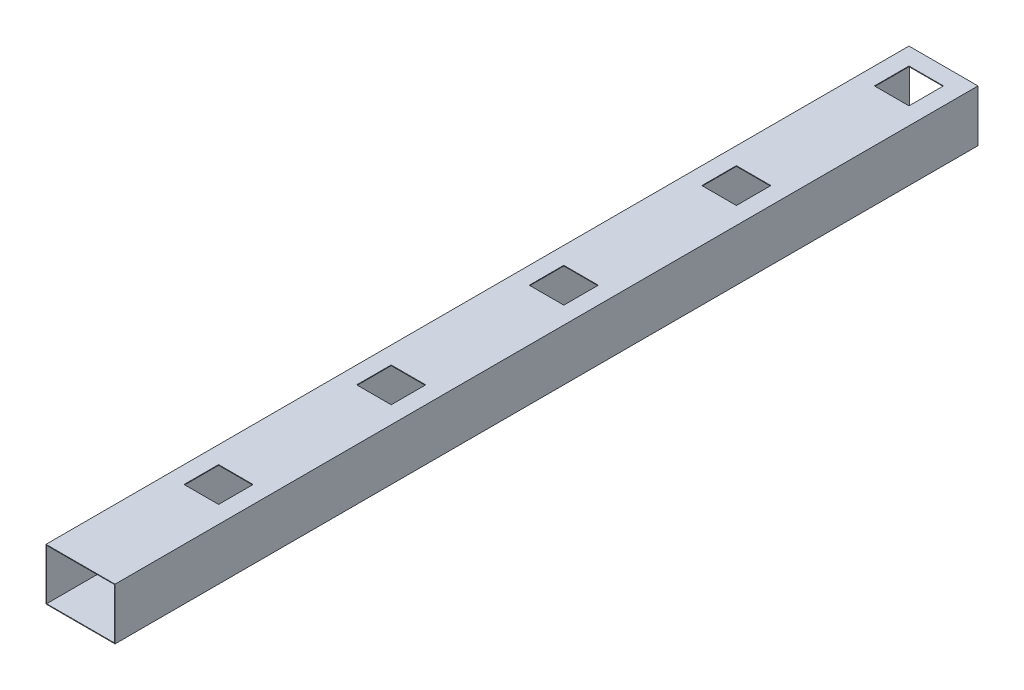
ISO-10303-21;
HEADER;
FILE_DESCRIPTION(('STEP AP214'),'2;1');
FILE_NAME('part.step','',(''),(''),'','','');
FILE_SCHEMA(('AUTOMOTIVE_DESIGN { 1 0 10303 214 1 1 1 1 }'));
ENDSEC;
DATA;
#1=APPLICATION_CONTEXT('core data for automotive mechanical design processes');
#2=APPLICATION_PROTOCOL_DEFINITION('international standard','automotive_design',2000,#1);
#3=PRODUCT_CONTEXT('',#1,'mechanical');
#4=PRODUCT('Part','Part','',(#3));
#5=PRODUCT_RELATED_PRODUCT_CATEGORY('part','',(#4));
#6=PRODUCT_DEFINITION_FORMATION('','',#4);
#7=PRODUCT_DEFINITION_CONTEXT('part definition',#1,'design');
#8=PRODUCT_DEFINITION('design','',#6,#7);
#9=PRODUCT_DEFINITION_SHAPE('','',#8);
#10=(LENGTH_UNIT() NAMED_UNIT(*) SI_UNIT(.MILLI.,.METRE.));
#11=(NAMED_UNIT(*) PLANE_ANGLE_UNIT() SI_UNIT($,.RADIAN.));
#12=(NAMED_UNIT(*) SI_UNIT($,.STERADIAN.) SOLID_ANGLE_UNIT());
#13=UNCERTAINTY_MEASURE_WITH_UNIT(LENGTH_MEASURE(1.E-05),#10,'distance_accuracy_value','');
#14=(GEOMETRIC_REPRESENTATION_CONTEXT(3) GLOBAL_UNCERTAINTY_ASSIGNED_CONTEXT((#13)) GLOBAL_UNIT_ASSIGNED_CONTEXT((#10,
#11,#12)) REPRESENTATION_CONTEXT('',''));
#15=CARTESIAN_POINT('',(0.,0.,0.));
#16=DIRECTION('',(0.,0.,1.));
#17=DIRECTION('',(1.,0.,0.));
#18=AXIS2_PLACEMENT_3D('',#15,#16,#17);
#19=CARTESIAN_POINT('',(-20.,-30.001,860.));
#20=DIRECTION('',(0.,0.,1.));
#21=DIRECTION('',(1.,0.,0.));
#22=AXIS2_PLACEMENT_3D('',#19,#20,#21);
#23=PLANE('',#22);
#24=DIRECTION('',(0.,1.,0.));
#25=VECTOR('',#24,1.);
#26=CARTESIAN_POINT('',(-20.,-30.001,860.));
#27=LINE('',#26,#25);
#28=CARTESIAN_POINT('',(-20.,29.3,860.));
#29=VERTEX_POINT('',#28);
#30=CARTESIAN_POINT('',(-20.,30.,860.));
#31=VERTEX_POINT('',#30);
#32=EDGE_CURVE('E11',#29,#31,#27,.T.);
#33=ORIENTED_EDGE('',*,*,#32,.T.);
#34=DIRECTION('',(1.,0.,0.));
#35=VECTOR('',#34,1.);
#36=CARTESIAN_POINT('',(-20.,30.,860.));
#37=LINE('',#36,#35);
#38=CARTESIAN_POINT('',(20.,30.,860.));
#39=VERTEX_POINT('',#38);
#40=EDGE_CURVE('E419',#31,#39,#37,.T.);
#41=ORIENTED_EDGE('',*,*,#40,.T.);
#42=DIRECTION('',(0.,1.,0.));
#43=VECTOR('',#42,1.);
#44=CARTESIAN_POINT('',(20.,-30.001,860.));
#45=LINE('',#44,#43);
#46=CARTESIAN_POINT('',(20.,29.3,860.));
#47=VERTEX_POINT('',#46);
#48=EDGE_CURVE('E425',#47,#39,#45,.T.);
#49=ORIENTED_EDGE('',*,*,#48,.F.);
#50=DIRECTION('',(1.,0.,0.));
#51=VECTOR('',#50,1.);
#52=CARTESIAN_POINT('',(-20.,29.3,860.));
#53=LINE('',#52,#51);
#54=EDGE_CURVE('E415',#29,#47,#53,.T.);
#55=ORIENTED_EDGE('',*,*,#54,.F.);
#56=EDGE_LOOP('',(#33,#41,#49,#55));
#57=FACE_BOUND('',#56,.T.);
#58=ADVANCED_FACE('F34',(#57),#23,.F.);
#59=CARTESIAN_POINT('',(-20.,-30.001,820.));
#60=DIRECTION('',(-1.,0.,0.));
#61=DIRECTION('',(0.,0.,1.));
#62=AXIS2_PLACEMENT_3D('',#59,#60,#61);
#63=PLANE('',#62);
#64=DIRECTION('',(0.,1.,0.));
#65=VECTOR('',#64,1.);
#66=CARTESIAN_POINT('',(-20.,-30.001,820.));
#67=LINE('',#66,#65);
#68=CARTESIAN_POINT('',(-20.,29.3,820.));
#69=VERTEX_POINT('',#68);
#70=CARTESIAN_POINT('',(-20.,30.,820.));
#71=VERTEX_POINT('',#70);
#72=EDGE_CURVE('E41',#69,#71,#67,.T.);
#73=ORIENTED_EDGE('',*,*,#72,.T.);
#74=DIRECTION('',(0.,0.,1.));
#75=VECTOR('',#74,1.);
#76=CARTESIAN_POINT('',(-20.,30.,820.));
#77=LINE('',#76,#75);
#78=EDGE_CURVE('E55',#71,#31,#77,.T.);
#79=ORIENTED_EDGE('',*,*,#78,.T.);
#80=ORIENTED_EDGE('',*,*,#32,.F.);
#81=DIRECTION('',(0.,0.,1.));
#82=VECTOR('',#81,1.);
#83=CARTESIAN_POINT('',(-20.,29.3,820.));
#84=LINE('',#83,#82);
#85=EDGE_CURVE('E413',#69,#29,#84,.T.);
#86=ORIENTED_EDGE('',*,*,#85,.F.);
#87=EDGE_LOOP('',(#73,#79,#80,#86));
#88=FACE_BOUND('',#87,.T.);
#89=ADVANCED_FACE('F433',(#88),#63,.F.);
#90=CARTESIAN_POINT('',(-20.,-30.001,820.));
#91=DIRECTION('',(0.,0.,1.));
#92=DIRECTION('',(1.,0.,0.));
#93=AXIS2_PLACEMENT_3D('',#90,#91,#92);
#94=PLANE('',#93);
#95=DIRECTION('',(1.,0.,0.));
#96=VECTOR('',#95,1.);
#97=CARTESIAN_POINT('',(-20.,29.3,820.));
#98=LINE('',#97,#96);
#99=CARTESIAN_POINT('',(20.,29.3,820.));
#100=VERTEX_POINT('',#99);
#101=EDGE_CURVE('E410',#69,#100,#98,.T.);
#102=ORIENTED_EDGE('',*,*,#101,.T.);
#103=DIRECTION('',(0.,1.,0.));
#104=VECTOR('',#103,1.);
#105=CARTESIAN_POINT('',(20.,-30.001,820.));
#106=LINE('',#105,#104);
#107=CARTESIAN_POINT('',(20.,30.,820.));
#108=VERTEX_POINT('',#107);
#109=EDGE_CURVE('E427',#100,#108,#106,.T.);
#110=ORIENTED_EDGE('',*,*,#109,.T.);
#111=DIRECTION('',(1.,0.,0.));
#112=VECTOR('',#111,1.);
#113=CARTESIAN_POINT('',(-20.,30.,820.));
#114=LINE('',#113,#112);
#115=EDGE_CURVE('E423',#71,#108,#114,.T.);
#116=ORIENTED_EDGE('',*,*,#115,.F.);
#117=ORIENTED_EDGE('',*,*,#72,.F.);
#118=EDGE_LOOP('',(#102,#110,#116,#117));
#119=FACE_BOUND('',#118,.T.);
#120=ADVANCED_FACE('F436',(#119),#94,.T.);
#121=CARTESIAN_POINT('',(20.,-30.001,820.));
#122=DIRECTION('',(-1.,0.,0.));
#123=DIRECTION('',(0.,0.,1.));
#124=AXIS2_PLACEMENT_3D('',#121,#122,#123);
#125=PLANE('',#124);
#126=DIRECTION('',(0.,0.,1.));
#127=VECTOR('',#126,1.);
#128=CARTESIAN_POINT('',(20.,29.3,820.));
#129=LINE('',#128,#127);
#130=EDGE_CURVE('E408',#100,#47,#129,.T.);
#131=ORIENTED_EDGE('',*,*,#130,.T.);
#132=ORIENTED_EDGE('',*,*,#48,.T.);
#133=DIRECTION('',(0.,0.,1.));
#134=VECTOR('',#133,1.);
#135=CARTESIAN_POINT('',(20.,30.,820.));
#136=LINE('',#135,#134);
#137=EDGE_CURVE('E48',#108,#39,#136,.T.);
#138=ORIENTED_EDGE('',*,*,#137,.F.);
#139=ORIENTED_EDGE('',*,*,#109,.F.);
#140=EDGE_LOOP('',(#131,#132,#138,#139));
#141=FACE_BOUND('',#140,.T.);
#142=ADVANCED_FACE('F440',(#141),#125,.T.);
#143=CARTESIAN_POINT('',(-20.,-30.001,660.));
#144=DIRECTION('',(0.,0.,1.));
#145=DIRECTION('',(1.,0.,0.));
#146=AXIS2_PLACEMENT_3D('',#143,#144,#145);
#147=PLANE('',#146);
#148=DIRECTION('',(0.,1.,0.));
#149=VECTOR('',#148,1.);
#150=CARTESIAN_POINT('',(-20.,-30.001,660.));
#151=LINE('',#150,#149);
#152=CARTESIAN_POINT('',(-20.,29.3,660.));
#153=VERTEX_POINT('',#152);
#154=CARTESIAN_POINT('',(-20.,30.,660.));
#155=VERTEX_POINT('',#154);
#156=EDGE_CURVE('E405',#153,#155,#151,.T.);
#157=ORIENTED_EDGE('',*,*,#156,.T.);
#158=DIRECTION('',(1.,0.,0.));
#159=VECTOR('',#158,1.);
#160=CARTESIAN_POINT('',(-20.,30.,660.));
#161=LINE('',#160,#159);
#162=CARTESIAN_POINT('',(20.,30.,660.));
#163=VERTEX_POINT('',#162);
#164=EDGE_CURVE('E387',#155,#163,#161,.T.);
#165=ORIENTED_EDGE('',*,*,#164,.T.);
#166=DIRECTION('',(0.,1.,0.));
#167=VECTOR('',#166,1.);
#168=CARTESIAN_POINT('',(20.,-30.001,660.));
#169=LINE('',#168,#167);
#170=CARTESIAN_POINT('',(20.,29.3,660.));
#171=VERTEX_POINT('',#170);
#172=EDGE_CURVE('E396',#171,#163,#169,.T.);
#173=ORIENTED_EDGE('',*,*,#172,.F.);
#174=DIRECTION('',(1.,0.,0.));
#175=VECTOR('',#174,1.);
#176=CARTESIAN_POINT('',(-20.,29.3,660.));
#177=LINE('',#176,#175);
#178=EDGE_CURVE('E382',#153,#171,#177,.T.);
#179=ORIENTED_EDGE('',*,*,#178,.F.);
#180=EDGE_LOOP('',(#157,#165,#173,#179));
#181=FACE_BOUND('',#180,.T.);
#182=ADVANCED_FACE('F472',(#181),#147,.F.);
#183=CARTESIAN_POINT('',(-20.,-30.001,620.));
#184=DIRECTION('',(-1.,0.,0.));
#185=DIRECTION('',(0.,0.,1.));
#186=AXIS2_PLACEMENT_3D('',#183,#184,#185);
#187=PLANE('',#186);
#188=DIRECTION('',(0.,1.,0.));
#189=VECTOR('',#188,1.);
#190=CARTESIAN_POINT('',(-20.,-30.001,620.));
#191=LINE('',#190,#189);
#192=CARTESIAN_POINT('',(-20.,29.3,620.));
#193=VERTEX_POINT('',#192);
#194=CARTESIAN_POINT('',(-20.,30.,620.));
#195=VERTEX_POINT('',#194);
#196=EDGE_CURVE('E402',#193,#195,#191,.T.);
#197=ORIENTED_EDGE('',*,*,#196,.T.);
#198=DIRECTION('',(0.,0.,1.));
#199=VECTOR('',#198,1.);
#200=CARTESIAN_POINT('',(-20.,30.,620.));
#201=LINE('',#200,#199);
#202=EDGE_CURVE('E390',#195,#155,#201,.T.);
#203=ORIENTED_EDGE('',*,*,#202,.T.);
#204=ORIENTED_EDGE('',*,*,#156,.F.);
#205=DIRECTION('',(0.,0.,1.));
#206=VECTOR('',#205,1.);
#207=CARTESIAN_POINT('',(-20.,29.3,620.));
#208=LINE('',#207,#206);
#209=EDGE_CURVE('E380',#193,#153,#208,.T.);
#210=ORIENTED_EDGE('',*,*,#209,.F.);
#211=EDGE_LOOP('',(#197,#203,#204,#210));
#212=FACE_BOUND('',#211,.T.);
#213=ADVANCED_FACE('F475',(#212),#187,.F.);
#214=CARTESIAN_POINT('',(-20.,-30.001,620.));
#215=DIRECTION('',(0.,0.,1.));
#216=DIRECTION('',(1.,0.,0.));
#217=AXIS2_PLACEMENT_3D('',#214,#215,#216);
#218=PLANE('',#217);
#219=DIRECTION('',(1.,0.,0.));
#220=VECTOR('',#219,1.);
#221=CARTESIAN_POINT('',(-20.,29.3,620.));
#222=LINE('',#221,#220);
#223=CARTESIAN_POINT('',(20.,29.3,620.));
#224=VERTEX_POINT('',#223);
#225=EDGE_CURVE('E377',#193,#224,#222,.T.);
#226=ORIENTED_EDGE('',*,*,#225,.T.);
#227=DIRECTION('',(0.,1.,0.));
#228=VECTOR('',#227,1.);
#229=CARTESIAN_POINT('',(20.,-30.001,620.));
#230=LINE('',#229,#228);
#231=CARTESIAN_POINT('',(20.,30.,620.));
#232=VERTEX_POINT('',#231);
#233=EDGE_CURVE('E399',#224,#232,#230,.T.);
#234=ORIENTED_EDGE('',*,*,#233,.T.);
#235=DIRECTION('',(1.,0.,0.));
#236=VECTOR('',#235,1.);
#237=CARTESIAN_POINT('',(-20.,30.,620.));
#238=LINE('',#237,#236);
#239=EDGE_CURVE('E393',#195,#232,#238,.T.);
#240=ORIENTED_EDGE('',*,*,#239,.F.);
#241=ORIENTED_EDGE('',*,*,#196,.F.);
#242=EDGE_LOOP('',(#226,#234,#240,#241));
#243=FACE_BOUND('',#242,.T.);
#244=ADVANCED_FACE('F479',(#243),#218,.T.);
#245=CARTESIAN_POINT('',(20.,-30.001,620.));
#246=DIRECTION('',(-1.,0.,0.));
#247=DIRECTION('',(0.,0.,1.));
#248=AXIS2_PLACEMENT_3D('',#245,#246,#247);
#249=PLANE('',#248);
#250=DIRECTION('',(0.,0.,1.));
#251=VECTOR('',#250,1.);
#252=CARTESIAN_POINT('',(20.,29.3,620.));
#253=LINE('',#252,#251);
#254=EDGE_CURVE('E375',#224,#171,#253,.T.);
#255=ORIENTED_EDGE('',*,*,#254,.T.);
#256=ORIENTED_EDGE('',*,*,#172,.T.);
#257=DIRECTION('',(0.,0.,1.));
#258=VECTOR('',#257,1.);
#259=CARTESIAN_POINT('',(20.,30.,620.));
#260=LINE('',#259,#258);
#261=EDGE_CURVE('E385',#232,#163,#260,.T.);
#262=ORIENTED_EDGE('',*,*,#261,.F.);
#263=ORIENTED_EDGE('',*,*,#233,.F.);
#264=EDGE_LOOP('',(#255,#256,#262,#263));
#265=FACE_BOUND('',#264,.T.);
#266=ADVANCED_FACE('F483',(#265),#249,.T.);
#267=CARTESIAN_POINT('',(-20.,-30.001,460.));
#268=DIRECTION('',(0.,0.,1.));
#269=DIRECTION('',(1.,0.,0.));
#270=AXIS2_PLACEMENT_3D('',#267,#268,#269);
#271=PLANE('',#270);
#272=DIRECTION('',(0.,1.,0.));
#273=VECTOR('',#272,1.);
#274=CARTESIAN_POINT('',(-20.,-30.001,460.));
#275=LINE('',#274,#273);
#276=CARTESIAN_POINT('',(-20.,29.3,460.));
#277=VERTEX_POINT('',#276);
#278=CARTESIAN_POINT('',(-20.,30.,460.));
#279=VERTEX_POINT('',#278);
#280=EDGE_CURVE('E372',#277,#279,#275,.T.);
#281=ORIENTED_EDGE('',*,*,#280,.T.);
#282=DIRECTION('',(1.,0.,0.));
#283=VECTOR('',#282,1.);
#284=CARTESIAN_POINT('',(-20.,30.,460.));
#285=LINE('',#284,#283);
#286=CARTESIAN_POINT('',(20.,30.,460.));
#287=VERTEX_POINT('',#286);
#288=EDGE_CURVE('E354',#279,#287,#285,.T.);
#289=ORIENTED_EDGE('',*,*,#288,.T.);
#290=DIRECTION('',(0.,1.,0.));
#291=VECTOR('',#290,1.);
#292=CARTESIAN_POINT('',(20.,-30.001,460.));
#293=LINE('',#292,#291);
#294=CARTESIAN_POINT('',(20.,29.3,460.));
#295=VERTEX_POINT('',#294);
#296=EDGE_CURVE('E363',#295,#287,#293,.T.);
#297=ORIENTED_EDGE('',*,*,#296,.F.);
#298=DIRECTION('',(1.,0.,0.));
#299=VECTOR('',#298,1.);
#300=CARTESIAN_POINT('',(-20.,29.3,460.));
#301=LINE('',#300,#299);
#302=EDGE_CURVE('E349',#277,#295,#301,.T.);
#303=ORIENTED_EDGE('',*,*,#302,.F.);
#304=EDGE_LOOP('',(#281,#289,#297,#303));
#305=FACE_BOUND('',#304,.T.);
#306=ADVANCED_FACE('F487',(#305),#271,.F.);
#307=CARTESIAN_POINT('',(-20.,-30.001,420.));
#308=DIRECTION('',(-1.,0.,0.));
#309=DIRECTION('',(0.,0.,1.));
#310=AXIS2_PLACEMENT_3D('',#307,#308,#309);
#311=PLANE('',#310);
#312=DIRECTION('',(0.,1.,0.));
#313=VECTOR('',#312,1.);
#314=CARTESIAN_POINT('',(-20.,-30.001,420.));
#315=LINE('',#314,#313);
#316=CARTESIAN_POINT('',(-20.,29.3,420.));
#317=VERTEX_POINT('',#316);
#318=CARTESIAN_POINT('',(-20.,30.,420.));
#319=VERTEX_POINT('',#318);
#320=EDGE_CURVE('E369',#317,#319,#315,.T.);
#321=ORIENTED_EDGE('',*,*,#320,.T.);
#322=DIRECTION('',(0.,0.,1.));
#323=VECTOR('',#322,1.);
#324=CARTESIAN_POINT('',(-20.,30.,420.));
#325=LINE('',#324,#323);
#326=EDGE_CURVE('E357',#319,#279,#325,.T.);
#327=ORIENTED_EDGE('',*,*,#326,.T.);
#328=ORIENTED_EDGE('',*,*,#280,.F.);
#329=DIRECTION('',(0.,0.,1.));
#330=VECTOR('',#329,1.);
#331=CARTESIAN_POINT('',(-20.,29.3,420.));
#332=LINE('',#331,#330);
#333=EDGE_CURVE('E347',#317,#277,#332,.T.);
#334=ORIENTED_EDGE('',*,*,#333,.F.);
#335=EDGE_LOOP('',(#321,#327,#328,#334));
#336=FACE_BOUND('',#335,.T.);
#337=ADVANCED_FACE('F491',(#336),#311,.F.);
#338=CARTESIAN_POINT('',(-20.,-30.001,420.));
#339=DIRECTION('',(0.,0.,1.));
#340=DIRECTION('',(1.,0.,0.));
#341=AXIS2_PLACEMENT_3D('',#338,#339,#340);
#342=PLANE('',#341);
#343=DIRECTION('',(1.,0.,0.));
#344=VECTOR('',#343,1.);
#345=CARTESIAN_POINT('',(-20.,29.3,420.));
#346=LINE('',#345,#344);
#347=CARTESIAN_POINT('',(20.,29.3,420.));
#348=VERTEX_POINT('',#347);
#349=EDGE_CURVE('E344',#317,#348,#346,.T.);
#350=ORIENTED_EDGE('',*,*,#349,.T.);
#351=DIRECTION('',(0.,1.,0.));
#352=VECTOR('',#351,1.);
#353=CARTESIAN_POINT('',(20.,-30.001,420.));
#354=LINE('',#353,#352);
#355=CARTESIAN_POINT('',(20.,30.,420.));
#356=VERTEX_POINT('',#355);
#357=EDGE_CURVE('E366',#348,#356,#354,.T.);
#358=ORIENTED_EDGE('',*,*,#357,.T.);
#359=DIRECTION('',(1.,0.,0.));
#360=VECTOR('',#359,1.);
#361=CARTESIAN_POINT('',(-20.,30.,420.));
#362=LINE('',#361,#360);
#363=EDGE_CURVE('E360',#319,#356,#362,.T.);
#364=ORIENTED_EDGE('',*,*,#363,.F.);
#365=ORIENTED_EDGE('',*,*,#320,.F.);
#366=EDGE_LOOP('',(#350,#358,#364,#365));
#367=FACE_BOUND('',#366,.T.);
#368=ADVANCED_FACE('F495',(#367),#342,.T.);
#369=CARTESIAN_POINT('',(20.,-30.001,420.));
#370=DIRECTION('',(-1.,0.,0.));
#371=DIRECTION('',(0.,0.,1.));
#372=AXIS2_PLACEMENT_3D('',#369,#370,#371);
#373=PLANE('',#372);
#374=DIRECTION('',(0.,0.,1.));
#375=VECTOR('',#374,1.);
#376=CARTESIAN_POINT('',(20.,29.3,420.));
#377=LINE('',#376,#375);
#378=EDGE_CURVE('E342',#348,#295,#377,.T.);
#379=ORIENTED_EDGE('',*,*,#378,.T.);
#380=ORIENTED_EDGE('',*,*,#296,.T.);
#381=DIRECTION('',(0.,0.,1.));
#382=VECTOR('',#381,1.);
#383=CARTESIAN_POINT('',(20.,30.,420.));
#384=LINE('',#383,#382);
#385=EDGE_CURVE('E352',#356,#287,#384,.T.);
#386=ORIENTED_EDGE('',*,*,#385,.F.);
#387=ORIENTED_EDGE('',*,*,#357,.F.);
#388=EDGE_LOOP('',(#379,#380,#386,#387));
#389=FACE_BOUND('',#388,.T.);
#390=ADVANCED_FACE('F454',(#389),#373,.T.);
#391=CARTESIAN_POINT('',(-40.,30.,1000.));
#392=DIRECTION('',(0.,-1.,0.));
#393=DIRECTION('',(0.,0.,-1.));
#394=AXIS2_PLACEMENT_3D('',#391,#392,#393);
#395=PLANE('',#394);
#396=DIRECTION('',(0.,0.,1.));
#397=VECTOR('',#396,1.);
#398=CARTESIAN_POINT('',(20.,30.,20.));
#399=LINE('',#398,#397);
#400=CARTESIAN_POINT('',(20.,30.,20.));
#401=VERTEX_POINT('',#400);
#402=CARTESIAN_POINT('',(20.,30.,60.));
#403=VERTEX_POINT('',#402);
#404=EDGE_CURVE('E264',#401,#403,#399,.T.);
#405=ORIENTED_EDGE('',*,*,#404,.T.);
#406=DIRECTION('',(1.,0.,0.));
#407=VECTOR('',#406,1.);
#408=CARTESIAN_POINT('',(-20.,30.,60.));
#409=LINE('',#408,#407);
#410=CARTESIAN_POINT('',(-20.,30.,60.0000000000001));
#411=VERTEX_POINT('',#410);
#412=EDGE_CURVE('E255',#411,#403,#409,.T.);
#413=ORIENTED_EDGE('',*,*,#412,.F.);
#414=DIRECTION('',(0.,0.,1.));
#415=VECTOR('',#414,1.);
#416=CARTESIAN_POINT('',(-20.,30.,20.));
#417=LINE('',#416,#415);
#418=CARTESIAN_POINT('',(-20.,30.,20.));
#419=VERTEX_POINT('',#418);
#420=EDGE_CURVE('E256',#419,#411,#417,.T.);
#421=ORIENTED_EDGE('',*,*,#420,.F.);
#422=DIRECTION('',(1.,0.,0.));
#423=VECTOR('',#422,1.);
#424=CARTESIAN_POINT('',(-20.,30.,20.));
#425=LINE('',#424,#423);
#426=EDGE_CURVE('E259',#419,#401,#425,.T.);
#427=ORIENTED_EDGE('',*,*,#426,.T.);
#428=EDGE_LOOP('',(#405,#413,#421,#427));
#429=FACE_BOUND('',#428,.T.);
#430=DIRECTION('',(-1.,0.,0.));
#431=VECTOR('',#430,1.);
#432=CARTESIAN_POINT('',(-40.,30.,0.));
#433=LINE('',#432,#431);
#434=CARTESIAN_POINT('',(40.,30.,0.));
#435=VERTEX_POINT('',#434);
#436=CARTESIAN_POINT('',(-40.,30.,0.));
#437=VERTEX_POINT('',#436);
#438=EDGE_CURVE('E326',#435,#437,#433,.T.);
#439=ORIENTED_EDGE('',*,*,#438,.T.);
#440=DIRECTION('',(0.,0.,-1.));
#441=VECTOR('',#440,1.);
#442=CARTESIAN_POINT('',(-40.,30.,1000.));
#443=LINE('',#442,#441);
#444=CARTESIAN_POINT('',(-40.,30.,1000.));
#445=VERTEX_POINT('',#444);
#446=EDGE_CURVE('E336',#445,#437,#443,.T.);
#447=ORIENTED_EDGE('',*,*,#446,.F.);
#448=DIRECTION('',(-1.,0.,0.));
#449=VECTOR('',#448,1.);
#450=CARTESIAN_POINT('',(-40.,30.,1000.));
#451=LINE('',#450,#449);
#452=CARTESIAN_POINT('',(40.,30.,1000.));
#453=VERTEX_POINT('',#452);
#454=EDGE_CURVE('E316',#453,#445,#451,.T.);
#455=ORIENTED_EDGE('',*,*,#454,.F.);
#456=DIRECTION('',(0.,0.,-1.));
#457=VECTOR('',#456,1.);
#458=CARTESIAN_POINT('',(40.,30.,1000.));
#459=LINE('',#458,#457);
#460=EDGE_CURVE('E339',#453,#435,#459,.T.);
#461=ORIENTED_EDGE('',*,*,#460,.T.);
#462=EDGE_LOOP('',(#439,#447,#455,#461));
#463=FACE_BOUND('',#462,.T.);
#464=DIRECTION('',(0.,0.,1.));
#465=VECTOR('',#464,1.);
#466=CARTESIAN_POINT('',(20.,30.,220.));
#467=LINE('',#466,#465);
#468=CARTESIAN_POINT('',(20.,30.,220.));
#469=VERTEX_POINT('',#468);
#470=CARTESIAN_POINT('',(20.,30.,260.));
#471=VERTEX_POINT('',#470);
#472=EDGE_CURVE('E236',#469,#471,#467,.T.);
#473=ORIENTED_EDGE('',*,*,#472,.T.);
#474=DIRECTION('',(1.,0.,0.));
#475=VECTOR('',#474,1.);
#476=CARTESIAN_POINT('',(-20.,30.,260.));
#477=LINE('',#476,#475);
#478=CARTESIAN_POINT('',(-20.,30.,260.));
#479=VERTEX_POINT('',#478);
#480=EDGE_CURVE('E220',#479,#471,#477,.T.);
#481=ORIENTED_EDGE('',*,*,#480,.F.);
#482=DIRECTION('',(0.,0.,1.));
#483=VECTOR('',#482,1.);
#484=CARTESIAN_POINT('',(-20.,30.,220.));
#485=LINE('',#484,#483);
#486=CARTESIAN_POINT('',(-20.,30.,220.));
#487=VERTEX_POINT('',#486);
#488=EDGE_CURVE('E740',#487,#479,#485,.T.);
#489=ORIENTED_EDGE('',*,*,#488,.F.);
#490=DIRECTION('',(1.,0.,0.));
#491=VECTOR('',#490,1.);
#492=CARTESIAN_POINT('',(-20.,30.,220.));
#493=LINE('',#492,#491);
#494=EDGE_CURVE('E245',#487,#469,#493,.T.);
#495=ORIENTED_EDGE('',*,*,#494,.T.);
#496=EDGE_LOOP('',(#473,#481,#489,#495));
#497=FACE_BOUND('',#496,.T.);
#498=ORIENTED_EDGE('',*,*,#385,.T.);
#499=ORIENTED_EDGE('',*,*,#288,.F.);
#500=ORIENTED_EDGE('',*,*,#326,.F.);
#501=ORIENTED_EDGE('',*,*,#363,.T.);
#502=EDGE_LOOP('',(#498,#499,#500,#501));
#503=FACE_BOUND('',#502,.T.);
#504=ORIENTED_EDGE('',*,*,#261,.T.);
#505=ORIENTED_EDGE('',*,*,#164,.F.);
#506=ORIENTED_EDGE('',*,*,#202,.F.);
#507=ORIENTED_EDGE('',*,*,#239,.T.);
#508=EDGE_LOOP('',(#504,#505,#506,#507));
#509=FACE_BOUND('',#508,.T.);
#510=ORIENTED_EDGE('',*,*,#137,.T.);
#511=ORIENTED_EDGE('',*,*,#40,.F.);
#512=ORIENTED_EDGE('',*,*,#78,.F.);
#513=ORIENTED_EDGE('',*,*,#115,.T.);
#514=EDGE_LOOP('',(#510,#511,#512,#513));
#515=FACE_BOUND('',#514,.T.);
#516=ADVANCED_FACE('F242',(#429,#463,#497,#503,#509,#515),#395,.F.);
#517=CARTESIAN_POINT('',(-39.3,29.3,1000.));
#518=DIRECTION('',(0.,-1.,0.));
#519=DIRECTION('',(0.,0.,-1.));
#520=AXIS2_PLACEMENT_3D('',#517,#518,#519);
#521=PLANE('',#520);
#522=DIRECTION('',(-1.,0.,0.));
#523=VECTOR('',#522,1.);
#524=CARTESIAN_POINT('',(-39.3,29.3,0.));
#525=LINE('',#524,#523);
#526=CARTESIAN_POINT('',(39.3,29.3,0.));
#527=VERTEX_POINT('',#526);
#528=CARTESIAN_POINT('',(-39.3,29.3,0.));
#529=VERTEX_POINT('',#528);
#530=EDGE_CURVE('E285',#527,#529,#525,.T.);
#531=ORIENTED_EDGE('',*,*,#530,.F.);
#532=DIRECTION('',(0.,0.,-1.));
#533=VECTOR('',#532,1.);
#534=CARTESIAN_POINT('',(39.3,29.3,1000.));
#535=LINE('',#534,#533);
#536=CARTESIAN_POINT('',(39.3,29.3,1000.));
#537=VERTEX_POINT('',#536);
#538=EDGE_CURVE('E305',#537,#527,#535,.T.);
#539=ORIENTED_EDGE('',*,*,#538,.F.);
#540=DIRECTION('',(-1.,0.,0.));
#541=VECTOR('',#540,1.);
#542=CARTESIAN_POINT('',(-39.3,29.3,1000.));
#543=LINE('',#542,#541);
#544=CARTESIAN_POINT('',(-39.3,29.3,1000.));
#545=VERTEX_POINT('',#544);
#546=EDGE_CURVE('E290',#537,#545,#543,.T.);
#547=ORIENTED_EDGE('',*,*,#546,.T.);
#548=DIRECTION('',(0.,0.,-1.));
#549=VECTOR('',#548,1.);
#550=CARTESIAN_POINT('',(-39.3,29.3,1000.));
#551=LINE('',#550,#549);
#552=EDGE_CURVE('E292',#545,#529,#551,.T.);
#553=ORIENTED_EDGE('',*,*,#552,.T.);
#554=EDGE_LOOP('',(#531,#539,#547,#553));
#555=FACE_BOUND('',#554,.T.);
#556=DIRECTION('',(1.,0.,0.));
#557=VECTOR('',#556,1.);
#558=CARTESIAN_POINT('',(-20.,29.3,60.));
#559=LINE('',#558,#557);
#560=CARTESIAN_POINT('',(-20.,29.3,60.));
#561=VERTEX_POINT('',#560);
#562=CARTESIAN_POINT('',(20.,29.3,60.0000000000001));
#563=VERTEX_POINT('',#562);
#564=EDGE_CURVE('E269',#561,#563,#559,.T.);
#565=ORIENTED_EDGE('',*,*,#564,.T.);
#566=DIRECTION('',(0.,0.,1.));
#567=VECTOR('',#566,1.);
#568=CARTESIAN_POINT('',(20.,29.3,20.));
#569=LINE('',#568,#567);
#570=CARTESIAN_POINT('',(20.,29.3,20.));
#571=VERTEX_POINT('',#570);
#572=EDGE_CURVE('E249',#571,#563,#569,.T.);
#573=ORIENTED_EDGE('',*,*,#572,.F.);
#574=DIRECTION('',(1.,0.,0.));
#575=VECTOR('',#574,1.);
#576=CARTESIAN_POINT('',(-20.,29.3,20.));
#577=LINE('',#576,#575);
#578=CARTESIAN_POINT('',(-20.,29.3,20.));
#579=VERTEX_POINT('',#578);
#580=EDGE_CURVE('E246',#579,#571,#577,.T.);
#581=ORIENTED_EDGE('',*,*,#580,.F.);
#582=DIRECTION('',(0.,0.,1.));
#583=VECTOR('',#582,1.);
#584=CARTESIAN_POINT('',(-20.,29.3,20.));
#585=LINE('',#584,#583);
#586=EDGE_CURVE('E262',#579,#561,#585,.T.);
#587=ORIENTED_EDGE('',*,*,#586,.T.);
#588=EDGE_LOOP('',(#565,#573,#581,#587));
#589=FACE_BOUND('',#588,.T.);
#590=DIRECTION('',(1.,0.,0.));
#591=VECTOR('',#590,1.);
#592=CARTESIAN_POINT('',(-20.,29.3,260.));
#593=LINE('',#592,#591);
#594=CARTESIAN_POINT('',(-20.,29.3,260.));
#595=VERTEX_POINT('',#594);
#596=CARTESIAN_POINT('',(20.,29.3,260.));
#597=VERTEX_POINT('',#596);
#598=EDGE_CURVE('E230',#595,#597,#593,.T.);
#599=ORIENTED_EDGE('',*,*,#598,.T.);
#600=DIRECTION('',(0.,0.,1.));
#601=VECTOR('',#600,1.);
#602=CARTESIAN_POINT('',(20.,29.3,220.));
#603=LINE('',#602,#601);
#604=CARTESIAN_POINT('',(20.,29.3,220.));
#605=VERTEX_POINT('',#604);
#606=EDGE_CURVE('E239',#605,#597,#603,.T.);
#607=ORIENTED_EDGE('',*,*,#606,.F.);
#608=DIRECTION('',(1.,0.,0.));
#609=VECTOR('',#608,1.);
#610=CARTESIAN_POINT('',(-20.,29.3,220.));
#611=LINE('',#610,#609);
#612=CARTESIAN_POINT('',(-20.,29.3,220.));
#613=VERTEX_POINT('',#612);
#614=EDGE_CURVE('E747',#613,#605,#611,.T.);
#615=ORIENTED_EDGE('',*,*,#614,.F.);
#616=DIRECTION('',(0.,0.,1.));
#617=VECTOR('',#616,1.);
#618=CARTESIAN_POINT('',(-20.,29.3,220.));
#619=LINE('',#618,#617);
#620=EDGE_CURVE('E742',#613,#595,#619,.T.);
#621=ORIENTED_EDGE('',*,*,#620,.T.);
#622=EDGE_LOOP('',(#599,#607,#615,#621));
#623=FACE_BOUND('',#622,.T.);
#624=ORIENTED_EDGE('',*,*,#378,.F.);
#625=ORIENTED_EDGE('',*,*,#349,.F.);
#626=ORIENTED_EDGE('',*,*,#333,.T.);
#627=ORIENTED_EDGE('',*,*,#302,.T.);
#628=EDGE_LOOP('',(#624,#625,#626,#627));
#629=FACE_BOUND('',#628,.T.);
#630=ORIENTED_EDGE('',*,*,#254,.F.);
#631=ORIENTED_EDGE('',*,*,#225,.F.);
#632=ORIENTED_EDGE('',*,*,#209,.T.);
#633=ORIENTED_EDGE('',*,*,#178,.T.);
#634=EDGE_LOOP('',(#630,#631,#632,#633));
#635=FACE_BOUND('',#634,.T.);
#636=ORIENTED_EDGE('',*,*,#130,.F.);
#637=ORIENTED_EDGE('',*,*,#101,.F.);
#638=ORIENTED_EDGE('',*,*,#85,.T.);
#639=ORIENTED_EDGE('',*,*,#54,.T.);
#640=EDGE_LOOP('',(#636,#637,#638,#639));
#641=FACE_BOUND('',#640,.T.);
#642=ADVANCED_FACE('F442',(#555,#589,#623,#629,#635,#641),#521,.T.);
#643=CARTESIAN_POINT('',(0.,0.,1000.));
#644=DIRECTION('',(0.,0.,1.));
#645=DIRECTION('',(1.,0.,0.));
#646=AXIS2_PLACEMENT_3D('',#643,#644,#645);
#647=PLANE('',#646);
#648=DIRECTION('',(0.,1.,0.));
#649=VECTOR('',#648,1.);
#650=CARTESIAN_POINT('',(40.,30.,1000.));
#651=LINE('',#650,#649);
#652=CARTESIAN_POINT('',(40.,-30.,1000.));
#653=VERTEX_POINT('',#652);
#654=EDGE_CURVE('E313',#653,#453,#651,.T.);
#655=ORIENTED_EDGE('',*,*,#654,.T.);
#656=ORIENTED_EDGE('',*,*,#454,.T.);
#657=DIRECTION('',(0.,-1.,0.));
#658=VECTOR('',#657,1.);
#659=CARTESIAN_POINT('',(-40.,30.,1000.));
#660=LINE('',#659,#658);
#661=CARTESIAN_POINT('',(-40.,-30.,1000.));
#662=VERTEX_POINT('',#661);
#663=EDGE_CURVE('E319',#445,#662,#660,.T.);
#664=ORIENTED_EDGE('',*,*,#663,.T.);
#665=DIRECTION('',(1.,0.,0.));
#666=VECTOR('',#665,1.);
#667=CARTESIAN_POINT('',(-40.,-30.,1000.));
#668=LINE('',#667,#666);
#669=EDGE_CURVE('E321',#662,#653,#668,.T.);
#670=ORIENTED_EDGE('',*,*,#669,.T.);
#671=EDGE_LOOP('',(#655,#656,#664,#670));
#672=FACE_BOUND('',#671,.T.);
#673=DIRECTION('',(1.,0.,0.));
#674=VECTOR('',#673,1.);
#675=CARTESIAN_POINT('',(-39.3,-29.3,1000.));
#676=LINE('',#675,#674);
#677=CARTESIAN_POINT('',(-39.3,-29.3,1000.));
#678=VERTEX_POINT('',#677);
#679=CARTESIAN_POINT('',(39.3,-29.3,1000.));
#680=VERTEX_POINT('',#679);
#681=EDGE_CURVE('E284',#678,#680,#676,.T.);
#682=ORIENTED_EDGE('',*,*,#681,.F.);
#683=DIRECTION('',(0.,-1.,0.));
#684=VECTOR('',#683,1.);
#685=CARTESIAN_POINT('',(-39.3,29.3,1000.));
#686=LINE('',#685,#684);
#687=EDGE_CURVE('E282',#545,#678,#686,.T.);
#688=ORIENTED_EDGE('',*,*,#687,.F.);
#689=ORIENTED_EDGE('',*,*,#546,.F.);
#690=DIRECTION('',(0.,1.,0.));
#691=VECTOR('',#690,1.);
#692=CARTESIAN_POINT('',(39.3,29.3,1000.));
#693=LINE('',#692,#691);
#694=EDGE_CURVE('E287',#680,#537,#693,.T.);
#695=ORIENTED_EDGE('',*,*,#694,.F.);
#696=EDGE_LOOP('',(#682,#688,#689,#695));
#697=FACE_BOUND('',#696,.T.);
#698=ADVANCED_FACE('F444',(#672,#697),#647,.T.);
#699=CARTESIAN_POINT('',(0.,0.,0.));
#700=DIRECTION('',(0.,0.,1.));
#701=DIRECTION('',(1.,0.,0.));
#702=AXIS2_PLACEMENT_3D('',#699,#700,#701);
#703=PLANE('',#702);
#704=DIRECTION('',(0.,1.,0.));
#705=VECTOR('',#704,1.);
#706=CARTESIAN_POINT('',(40.,30.,0.));
#707=LINE('',#706,#705);
#708=CARTESIAN_POINT('',(40.,-30.,0.));
#709=VERTEX_POINT('',#708);
#710=EDGE_CURVE('E312',#709,#435,#707,.T.);
#711=ORIENTED_EDGE('',*,*,#710,.F.);
#712=DIRECTION('',(1.,0.,0.));
#713=VECTOR('',#712,1.);
#714=CARTESIAN_POINT('',(-40.,-30.,0.));
#715=LINE('',#714,#713);
#716=CARTESIAN_POINT('',(-40.,-30.,0.));
#717=VERTEX_POINT('',#716);
#718=EDGE_CURVE('E317',#717,#709,#715,.T.);
#719=ORIENTED_EDGE('',*,*,#718,.F.);
#720=DIRECTION('',(0.,-1.,0.));
#721=VECTOR('',#720,1.);
#722=CARTESIAN_POINT('',(-40.,30.,0.));
#723=LINE('',#722,#721);
#724=EDGE_CURVE('E328',#437,#717,#723,.T.);
#725=ORIENTED_EDGE('',*,*,#724,.F.);
#726=ORIENTED_EDGE('',*,*,#438,.F.);
#727=EDGE_LOOP('',(#711,#719,#725,#726));
#728=FACE_BOUND('',#727,.T.);
#729=DIRECTION('',(0.,-1.,0.));
#730=VECTOR('',#729,1.);
#731=CARTESIAN_POINT('',(-39.3,29.3,0.));
#732=LINE('',#731,#730);
#733=CARTESIAN_POINT('',(-39.3,-29.3,0.));
#734=VERTEX_POINT('',#733);
#735=EDGE_CURVE('E281',#529,#734,#732,.T.);
#736=ORIENTED_EDGE('',*,*,#735,.T.);
#737=DIRECTION('',(1.,0.,0.));
#738=VECTOR('',#737,1.);
#739=CARTESIAN_POINT('',(-39.3,-29.3,0.));
#740=LINE('',#739,#738);
#741=CARTESIAN_POINT('',(39.3,-29.3,0.));
#742=VERTEX_POINT('',#741);
#743=EDGE_CURVE('E295',#734,#742,#740,.T.);
#744=ORIENTED_EDGE('',*,*,#743,.T.);
#745=DIRECTION('',(0.,1.,0.));
#746=VECTOR('',#745,1.);
#747=CARTESIAN_POINT('',(39.3,29.3,0.));
#748=LINE('',#747,#746);
#749=EDGE_CURVE('E298',#742,#527,#748,.T.);
#750=ORIENTED_EDGE('',*,*,#749,.T.);
#751=ORIENTED_EDGE('',*,*,#530,.T.);
#752=EDGE_LOOP('',(#736,#744,#750,#751));
#753=FACE_BOUND('',#752,.T.);
#754=ADVANCED_FACE('F451',(#728,#753),#703,.F.);
#755=CARTESIAN_POINT('',(40.,30.,1000.));
#756=DIRECTION('',(-1.,0.,0.));
#757=DIRECTION('',(0.,0.,1.));
#758=AXIS2_PLACEMENT_3D('',#755,#756,#757);
#759=PLANE('',#758);
#760=ORIENTED_EDGE('',*,*,#710,.T.);
#761=ORIENTED_EDGE('',*,*,#460,.F.);
#762=ORIENTED_EDGE('',*,*,#654,.F.);
#763=DIRECTION('',(0.,0.,-1.));
#764=VECTOR('',#763,1.);
#765=CARTESIAN_POINT('',(40.,-30.,1000.));
#766=LINE('',#765,#764);
#767=EDGE_CURVE('E323',#653,#709,#766,.T.);
#768=ORIENTED_EDGE('',*,*,#767,.T.);
#769=EDGE_LOOP('',(#760,#761,#762,#768));
#770=FACE_BOUND('',#769,.T.);
#771=ADVANCED_FACE('F503',(#770),#759,.F.);
#772=CARTESIAN_POINT('',(-40.,30.,1000.));
#773=DIRECTION('',(1.,0.,0.));
#774=DIRECTION('',(0.,1.,0.));
#775=AXIS2_PLACEMENT_3D('',#772,#773,#774);
#776=PLANE('',#775);
#777=ORIENTED_EDGE('',*,*,#724,.T.);
#778=DIRECTION('',(0.,0.,-1.));
#779=VECTOR('',#778,1.);
#780=CARTESIAN_POINT('',(-40.,-30.,1000.));
#781=LINE('',#780,#779);
#782=EDGE_CURVE('E333',#662,#717,#781,.T.);
#783=ORIENTED_EDGE('',*,*,#782,.F.);
#784=ORIENTED_EDGE('',*,*,#663,.F.);
#785=ORIENTED_EDGE('',*,*,#446,.T.);
#786=EDGE_LOOP('',(#777,#783,#784,#785));
#787=FACE_BOUND('',#786,.T.);
#788=ADVANCED_FACE('F505',(#787),#776,.F.);
#789=CARTESIAN_POINT('',(-40.,-30.,1000.));
#790=DIRECTION('',(0.,1.,0.));
#791=DIRECTION('',(0.,0.,1.));
#792=AXIS2_PLACEMENT_3D('',#789,#790,#791);
#793=PLANE('',#792);
#794=ORIENTED_EDGE('',*,*,#718,.T.);
#795=ORIENTED_EDGE('',*,*,#767,.F.);
#796=ORIENTED_EDGE('',*,*,#669,.F.);
#797=ORIENTED_EDGE('',*,*,#782,.T.);
#798=EDGE_LOOP('',(#794,#795,#796,#797));
#799=FACE_BOUND('',#798,.T.);
#800=ADVANCED_FACE('F510',(#799),#793,.F.);
#801=CARTESIAN_POINT('',(-39.3,29.3,1000.));
#802=DIRECTION('',(1.,0.,0.));
#803=DIRECTION('',(0.,1.,0.));
#804=AXIS2_PLACEMENT_3D('',#801,#802,#803);
#805=PLANE('',#804);
#806=ORIENTED_EDGE('',*,*,#735,.F.);
#807=ORIENTED_EDGE('',*,*,#552,.F.);
#808=ORIENTED_EDGE('',*,*,#687,.T.);
#809=DIRECTION('',(0.,0.,-1.));
#810=VECTOR('',#809,1.);
#811=CARTESIAN_POINT('',(-39.3,-29.3,1000.));
#812=LINE('',#811,#810);
#813=EDGE_CURVE('E309',#678,#734,#812,.T.);
#814=ORIENTED_EDGE('',*,*,#813,.T.);
#815=EDGE_LOOP('',(#806,#807,#808,#814));
#816=FACE_BOUND('',#815,.T.);
#817=ADVANCED_FACE('F514',(#816),#805,.T.);
#818=CARTESIAN_POINT('',(-39.3,-29.3,1000.));
#819=DIRECTION('',(0.,1.,0.));
#820=DIRECTION('',(-1.,0.,0.));
#821=AXIS2_PLACEMENT_3D('',#818,#819,#820);
#822=PLANE('',#821);
#823=ORIENTED_EDGE('',*,*,#743,.F.);
#824=ORIENTED_EDGE('',*,*,#813,.F.);
#825=ORIENTED_EDGE('',*,*,#681,.T.);
#826=DIRECTION('',(0.,0.,-1.));
#827=VECTOR('',#826,1.);
#828=CARTESIAN_POINT('',(39.3,-29.3,1000.));
#829=LINE('',#828,#827);
#830=EDGE_CURVE('E307',#680,#742,#829,.T.);
#831=ORIENTED_EDGE('',*,*,#830,.T.);
#832=EDGE_LOOP('',(#823,#824,#825,#831));
#833=FACE_BOUND('',#832,.T.);
#834=ADVANCED_FACE('F521',(#833),#822,.T.);
#835=CARTESIAN_POINT('',(39.3,29.3,1000.));
#836=DIRECTION('',(-1.,0.,0.));
#837=DIRECTION('',(0.,-1.,0.));
#838=AXIS2_PLACEMENT_3D('',#835,#836,#837);
#839=PLANE('',#838);
#840=ORIENTED_EDGE('',*,*,#749,.F.);
#841=ORIENTED_EDGE('',*,*,#830,.F.);
#842=ORIENTED_EDGE('',*,*,#694,.T.);
#843=ORIENTED_EDGE('',*,*,#538,.T.);
#844=EDGE_LOOP('',(#840,#841,#842,#843));
#845=FACE_BOUND('',#844,.T.);
#846=ADVANCED_FACE('F524',(#845),#839,.T.);
#847=CARTESIAN_POINT('',(20.,-30.001,20.));
#848=DIRECTION('',(-1.,0.,0.));
#849=DIRECTION('',(0.,0.,1.));
#850=AXIS2_PLACEMENT_3D('',#847,#848,#849);
#851=PLANE('',#850);
#852=ORIENTED_EDGE('',*,*,#572,.T.);
#853=DIRECTION('',(0.,1.,0.));
#854=VECTOR('',#853,1.);
#855=CARTESIAN_POINT('',(20.,-30.001,60.));
#856=LINE('',#855,#854);
#857=EDGE_CURVE('E272',#563,#403,#856,.T.);
#858=ORIENTED_EDGE('',*,*,#857,.T.);
#859=ORIENTED_EDGE('',*,*,#404,.F.);
#860=DIRECTION('',(0.,1.,0.));
#861=VECTOR('',#860,1.);
#862=CARTESIAN_POINT('',(20.,-30.001,20.));
#863=LINE('',#862,#861);
#864=EDGE_CURVE('E258',#571,#401,#863,.T.);
#865=ORIENTED_EDGE('',*,*,#864,.F.);
#866=EDGE_LOOP('',(#852,#858,#859,#865));
#867=FACE_BOUND('',#866,.T.);
#868=ADVANCED_FACE('F527',(#867),#851,.T.);
#869=CARTESIAN_POINT('',(-20.,-30.001,20.));
#870=DIRECTION('',(0.,0.,1.));
#871=DIRECTION('',(1.,0.,0.));
#872=AXIS2_PLACEMENT_3D('',#869,#870,#871);
#873=PLANE('',#872);
#874=ORIENTED_EDGE('',*,*,#580,.T.);
#875=ORIENTED_EDGE('',*,*,#864,.T.);
#876=ORIENTED_EDGE('',*,*,#426,.F.);
#877=DIRECTION('',(0.,1.,0.));
#878=VECTOR('',#877,1.);
#879=CARTESIAN_POINT('',(-20.,-30.001,20.));
#880=LINE('',#879,#878);
#881=EDGE_CURVE('E263',#579,#419,#880,.T.);
#882=ORIENTED_EDGE('',*,*,#881,.F.);
#883=EDGE_LOOP('',(#874,#875,#876,#882));
#884=FACE_BOUND('',#883,.T.);
#885=ADVANCED_FACE('F532',(#884),#873,.T.);
#886=CARTESIAN_POINT('',(-20.,-30.001,20.));
#887=DIRECTION('',(-1.,0.,0.));
#888=DIRECTION('',(0.,0.,1.));
#889=AXIS2_PLACEMENT_3D('',#886,#887,#888);
#890=PLANE('',#889);
#891=ORIENTED_EDGE('',*,*,#881,.T.);
#892=ORIENTED_EDGE('',*,*,#420,.T.);
#893=DIRECTION('',(0.,1.,0.));
#894=VECTOR('',#893,1.);
#895=CARTESIAN_POINT('',(-20.,-30.001,60.));
#896=LINE('',#895,#894);
#897=EDGE_CURVE('E273',#561,#411,#896,.T.);
#898=ORIENTED_EDGE('',*,*,#897,.F.);
#899=ORIENTED_EDGE('',*,*,#586,.F.);
#900=EDGE_LOOP('',(#891,#892,#898,#899));
#901=FACE_BOUND('',#900,.T.);
#902=ADVANCED_FACE('F547',(#901),#890,.F.);
#903=CARTESIAN_POINT('',(-20.,-30.001,60.));
#904=DIRECTION('',(0.,0.,1.));
#905=DIRECTION('',(1.,0.,0.));
#906=AXIS2_PLACEMENT_3D('',#903,#904,#905);
#907=PLANE('',#906);
#908=ORIENTED_EDGE('',*,*,#897,.T.);
#909=ORIENTED_EDGE('',*,*,#412,.T.);
#910=ORIENTED_EDGE('',*,*,#857,.F.);
#911=ORIENTED_EDGE('',*,*,#564,.F.);
#912=EDGE_LOOP('',(#908,#909,#910,#911));
#913=FACE_BOUND('',#912,.T.);
#914=ADVANCED_FACE('F553',(#913),#907,.F.);
#915=CARTESIAN_POINT('',(20.,-30.001,220.));
#916=DIRECTION('',(-1.,0.,0.));
#917=DIRECTION('',(0.,0.,1.));
#918=AXIS2_PLACEMENT_3D('',#915,#916,#917);
#919=PLANE('',#918);
#920=ORIENTED_EDGE('',*,*,#606,.T.);
#921=DIRECTION('',(0.,1.,0.));
#922=VECTOR('',#921,1.);
#923=CARTESIAN_POINT('',(20.,-30.001,260.));
#924=LINE('',#923,#922);
#925=EDGE_CURVE('E223',#597,#471,#924,.T.);
#926=ORIENTED_EDGE('',*,*,#925,.T.);
#927=ORIENTED_EDGE('',*,*,#472,.F.);
#928=DIRECTION('',(0.,1.,0.));
#929=VECTOR('',#928,1.);
#930=CARTESIAN_POINT('',(20.,-30.001,220.));
#931=LINE('',#930,#929);
#932=EDGE_CURVE('E745',#605,#469,#931,.T.);
#933=ORIENTED_EDGE('',*,*,#932,.F.);
#934=EDGE_LOOP('',(#920,#926,#927,#933));
#935=FACE_BOUND('',#934,.T.);
#936=ADVANCED_FACE('F234',(#935),#919,.T.);
#937=CARTESIAN_POINT('',(-20.,-30.001,220.));
#938=DIRECTION('',(0.,0.,1.));
#939=DIRECTION('',(1.,0.,0.));
#940=AXIS2_PLACEMENT_3D('',#937,#938,#939);
#941=PLANE('',#940);
#942=ORIENTED_EDGE('',*,*,#614,.T.);
#943=ORIENTED_EDGE('',*,*,#932,.T.);
#944=ORIENTED_EDGE('',*,*,#494,.F.);
#945=DIRECTION('',(0.,1.,0.));
#946=VECTOR('',#945,1.);
#947=CARTESIAN_POINT('',(-20.,-30.001,220.));
#948=LINE('',#947,#946);
#949=EDGE_CURVE('E240',#613,#487,#948,.T.);
#950=ORIENTED_EDGE('',*,*,#949,.F.);
#951=EDGE_LOOP('',(#942,#943,#944,#950));
#952=FACE_BOUND('',#951,.T.);
#953=ADVANCED_FACE('F560',(#952),#941,.T.);
#954=CARTESIAN_POINT('',(-20.,-30.001,220.));
#955=DIRECTION('',(-1.,0.,0.));
#956=DIRECTION('',(0.,0.,1.));
#957=AXIS2_PLACEMENT_3D('',#954,#955,#956);
#958=PLANE('',#957);
#959=ORIENTED_EDGE('',*,*,#949,.T.);
#960=ORIENTED_EDGE('',*,*,#488,.T.);
#961=DIRECTION('',(0.,1.,0.));
#962=VECTOR('',#961,1.);
#963=CARTESIAN_POINT('',(-20.,-30.001,260.));
#964=LINE('',#963,#962);
#965=EDGE_CURVE('E226',#595,#479,#964,.T.);
#966=ORIENTED_EDGE('',*,*,#965,.F.);
#967=ORIENTED_EDGE('',*,*,#620,.F.);
#968=EDGE_LOOP('',(#959,#960,#966,#967));
#969=FACE_BOUND('',#968,.T.);
#970=ADVANCED_FACE('F563',(#969),#958,.F.);
#971=CARTESIAN_POINT('',(-20.,-30.001,260.));
#972=DIRECTION('',(0.,0.,1.));
#973=DIRECTION('',(1.,0.,0.));
#974=AXIS2_PLACEMENT_3D('',#971,#972,#973);
#975=PLANE('',#974);
#976=ORIENTED_EDGE('',*,*,#965,.T.);
#977=ORIENTED_EDGE('',*,*,#480,.T.);
#978=ORIENTED_EDGE('',*,*,#925,.F.);
#979=ORIENTED_EDGE('',*,*,#598,.F.);
#980=EDGE_LOOP('',(#976,#977,#978,#979));
#981=FACE_BOUND('',#980,.T.);
#982=ADVANCED_FACE('F222',(#981),#975,.F.);
#983=CLOSED_SHELL('',(#58,#89,#120,#142,#182,#213,#244,#266,#306,#337,#368,#390,#516,#642,#698,
#754,#771,#788,#800,#817,#834,#846,#868,#885,#902,#914,#936,#953,#970,#982));
#984=MANIFOLD_SOLID_BREP('B2',#983);
#985=ADVANCED_BREP_SHAPE_REPRESENTATION('',(#18,#984),#14);
#986=SHAPE_DEFINITION_REPRESENTATION(#9,#985);
ENDSEC;
END-ISO-10303-21;
